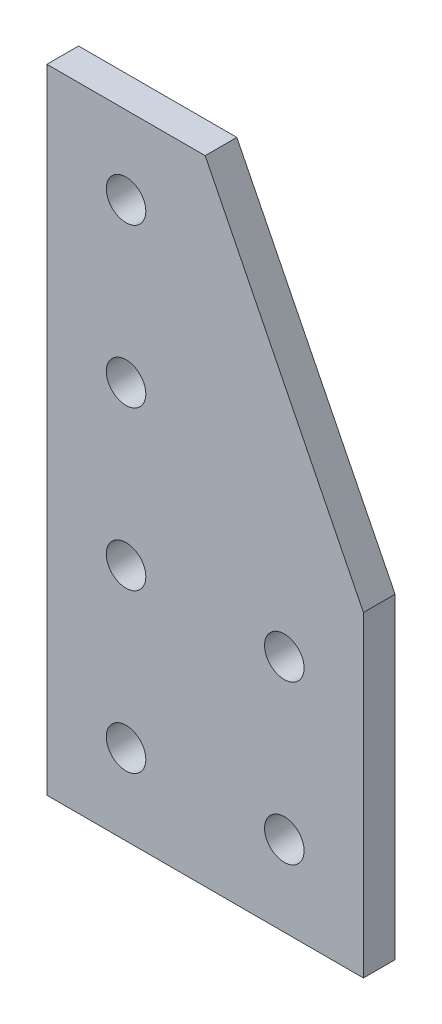
ISO-10303-21;
HEADER;
FILE_DESCRIPTION(('STEP AP214'),'2;1');
FILE_NAME('part.step','',(''),(''),'','','');
FILE_SCHEMA(('AUTOMOTIVE_DESIGN { 1 0 10303 214 1 1 1 1 }'));
ENDSEC;
DATA;
#1=APPLICATION_CONTEXT('core data for automotive mechanical design processes');
#2=APPLICATION_PROTOCOL_DEFINITION('international standard','automotive_design',2000,#1);
#3=PRODUCT_CONTEXT('',#1,'mechanical');
#4=PRODUCT('Part','Part','',(#3));
#5=PRODUCT_RELATED_PRODUCT_CATEGORY('part','',(#4));
#6=PRODUCT_DEFINITION_FORMATION('','',#4);
#7=PRODUCT_DEFINITION_CONTEXT('part definition',#1,'design');
#8=PRODUCT_DEFINITION('design','',#6,#7);
#9=PRODUCT_DEFINITION_SHAPE('','',#8);
#10=(LENGTH_UNIT() NAMED_UNIT(*) SI_UNIT(.MILLI.,.METRE.));
#11=(NAMED_UNIT(*) PLANE_ANGLE_UNIT() SI_UNIT($,.RADIAN.));
#12=(NAMED_UNIT(*) SI_UNIT($,.STERADIAN.) SOLID_ANGLE_UNIT());
#13=UNCERTAINTY_MEASURE_WITH_UNIT(LENGTH_MEASURE(1.E-05),#10,'distance_accuracy_value','');
#14=(GEOMETRIC_REPRESENTATION_CONTEXT(3) GLOBAL_UNCERTAINTY_ASSIGNED_CONTEXT((#13)) GLOBAL_UNIT_ASSIGNED_CONTEXT((#10,
#11,#12)) REPRESENTATION_CONTEXT('',''));
#15=CARTESIAN_POINT('',(0.,0.,0.));
#16=DIRECTION('',(0.,0.,1.));
#17=DIRECTION('',(1.,0.,0.));
#18=AXIS2_PLACEMENT_3D('',#15,#16,#17);
#19=CARTESIAN_POINT('',(0.,-40.,4.));
#20=DIRECTION('',(0.,-1.,0.));
#21=DIRECTION('',(0.,0.,-1.));
#22=AXIS2_PLACEMENT_3D('',#19,#20,#21);
#23=PLANE('',#22);
#24=DIRECTION('',(-1.,0.,0.));
#25=VECTOR('',#24,1.);
#26=CARTESIAN_POINT('',(0.,-40.,0.));
#27=LINE('',#26,#25);
#28=CARTESIAN_POINT('',(40.,-40.,0.));
#29=VERTEX_POINT('',#28);
#30=CARTESIAN_POINT('',(0.,-40.,0.));
#31=VERTEX_POINT('',#30);
#32=EDGE_CURVE('E150',#29,#31,#27,.T.);
#33=ORIENTED_EDGE('',*,*,#32,.F.);
#34=DIRECTION('',(0.,0.,-1.));
#35=VECTOR('',#34,1.);
#36=CARTESIAN_POINT('',(40.,-40.,4.));
#37=LINE('',#36,#35);
#38=CARTESIAN_POINT('',(40.,-40.,4.));
#39=VERTEX_POINT('',#38);
#40=EDGE_CURVE('E11',#39,#29,#37,.T.);
#41=ORIENTED_EDGE('',*,*,#40,.F.);
#42=DIRECTION('',(-1.,0.,0.));
#43=VECTOR('',#42,1.);
#44=CARTESIAN_POINT('',(0.,-40.,4.));
#45=LINE('',#44,#43);
#46=CARTESIAN_POINT('',(0.,-40.,4.));
#47=VERTEX_POINT('',#46);
#48=EDGE_CURVE('E190',#39,#47,#45,.T.);
#49=ORIENTED_EDGE('',*,*,#48,.T.);
#50=DIRECTION('',(0.,0.,-1.));
#51=VECTOR('',#50,1.);
#52=CARTESIAN_POINT('',(0.,-40.,4.));
#53=LINE('',#52,#51);
#54=EDGE_CURVE('E64',#47,#31,#53,.T.);
#55=ORIENTED_EDGE('',*,*,#54,.T.);
#56=EDGE_LOOP('',(#33,#41,#49,#55));
#57=FACE_BOUND('',#56,.T.);
#58=ADVANCED_FACE('F47',(#57),#23,.T.);
#59=CARTESIAN_POINT('',(40.,0.,4.));
#60=DIRECTION('',(1.,0.,0.));
#61=DIRECTION('',(0.,1.,0.));
#62=AXIS2_PLACEMENT_3D('',#59,#60,#61);
#63=PLANE('',#62);
#64=DIRECTION('',(0.,-1.,0.));
#65=VECTOR('',#64,1.);
#66=CARTESIAN_POINT('',(40.,0.,0.));
#67=LINE('',#66,#65);
#68=CARTESIAN_POINT('',(40.,0.,0.));
#69=VERTEX_POINT('',#68);
#70=EDGE_CURVE('E153',#69,#29,#67,.T.);
#71=ORIENTED_EDGE('',*,*,#70,.F.);
#72=DIRECTION('',(0.,0.,-1.));
#73=VECTOR('',#72,1.);
#74=CARTESIAN_POINT('',(40.,0.,4.));
#75=LINE('',#74,#73);
#76=CARTESIAN_POINT('',(40.,0.,4.));
#77=VERTEX_POINT('',#76);
#78=EDGE_CURVE('E56',#77,#69,#75,.T.);
#79=ORIENTED_EDGE('',*,*,#78,.F.);
#80=DIRECTION('',(0.,-1.,0.));
#81=VECTOR('',#80,1.);
#82=CARTESIAN_POINT('',(40.,0.,4.));
#83=LINE('',#82,#81);
#84=EDGE_CURVE('E115',#77,#39,#83,.T.);
#85=ORIENTED_EDGE('',*,*,#84,.T.);
#86=ORIENTED_EDGE('',*,*,#40,.T.);
#87=EDGE_LOOP('',(#71,#79,#85,#86));
#88=FACE_BOUND('',#87,.T.);
#89=ADVANCED_FACE('F197',(#88),#63,.T.);
#90=CARTESIAN_POINT('',(32.,16.,4.));
#91=DIRECTION('',(0.894427190999916,0.447213595499958,0.));
#92=DIRECTION('',(-0.447213595499958,0.894427190999916,0.));
#93=AXIS2_PLACEMENT_3D('',#90,#91,#92);
#94=PLANE('',#93);
#95=DIRECTION('',(0.447213595499958,-0.894427190999916,0.));
#96=VECTOR('',#95,1.);
#97=CARTESIAN_POINT('',(32.,16.,0.));
#98=LINE('',#97,#96);
#99=CARTESIAN_POINT('',(20.,40.,0.));
#100=VERTEX_POINT('',#99);
#101=EDGE_CURVE('E101',#100,#69,#98,.T.);
#102=ORIENTED_EDGE('',*,*,#101,.F.);
#103=DIRECTION('',(0.,0.,-1.));
#104=VECTOR('',#103,1.);
#105=CARTESIAN_POINT('',(20.,40.,4.));
#106=LINE('',#105,#104);
#107=CARTESIAN_POINT('',(20.,40.,4.));
#108=VERTEX_POINT('',#107);
#109=EDGE_CURVE('E96',#108,#100,#106,.T.);
#110=ORIENTED_EDGE('',*,*,#109,.F.);
#111=DIRECTION('',(0.447213595499958,-0.894427190999916,0.));
#112=VECTOR('',#111,1.);
#113=CARTESIAN_POINT('',(32.,16.,4.));
#114=LINE('',#113,#112);
#115=EDGE_CURVE('E99',#108,#77,#114,.T.);
#116=ORIENTED_EDGE('',*,*,#115,.T.);
#117=ORIENTED_EDGE('',*,*,#78,.T.);
#118=EDGE_LOOP('',(#102,#110,#116,#117));
#119=FACE_BOUND('',#118,.T.);
#120=ADVANCED_FACE('F98',(#119),#94,.T.);
#121=CARTESIAN_POINT('',(0.,40.,4.));
#122=DIRECTION('',(0.,1.,0.));
#123=DIRECTION('',(0.,0.,1.));
#124=AXIS2_PLACEMENT_3D('',#121,#122,#123);
#125=PLANE('',#124);
#126=DIRECTION('',(1.,0.,0.));
#127=VECTOR('',#126,1.);
#128=CARTESIAN_POINT('',(0.,40.,0.));
#129=LINE('',#128,#127);
#130=CARTESIAN_POINT('',(0.,40.,0.));
#131=VERTEX_POINT('',#130);
#132=EDGE_CURVE('E159',#131,#100,#129,.T.);
#133=ORIENTED_EDGE('',*,*,#132,.F.);
#134=DIRECTION('',(0.,0.,-1.));
#135=VECTOR('',#134,1.);
#136=CARTESIAN_POINT('',(0.,40.,4.));
#137=LINE('',#136,#135);
#138=CARTESIAN_POINT('',(0.,40.,4.));
#139=VERTEX_POINT('',#138);
#140=EDGE_CURVE('E80',#139,#131,#137,.T.);
#141=ORIENTED_EDGE('',*,*,#140,.F.);
#142=DIRECTION('',(1.,0.,0.));
#143=VECTOR('',#142,1.);
#144=CARTESIAN_POINT('',(0.,40.,4.));
#145=LINE('',#144,#143);
#146=EDGE_CURVE('E113',#139,#108,#145,.T.);
#147=ORIENTED_EDGE('',*,*,#146,.T.);
#148=ORIENTED_EDGE('',*,*,#109,.T.);
#149=EDGE_LOOP('',(#133,#141,#147,#148));
#150=FACE_BOUND('',#149,.T.);
#151=ADVANCED_FACE('F118',(#150),#125,.T.);
#152=CARTESIAN_POINT('',(30.,-29.84,4.));
#153=DIRECTION('',(0.,0.,-1.));
#154=DIRECTION('',(-1.,0.,0.));
#155=AXIS2_PLACEMENT_3D('',#152,#153,#154);
#156=CYLINDRICAL_SURFACE('',#155,2.5);
#157=CARTESIAN_POINT('',(30.,-29.84,4.));
#158=DIRECTION('',(0.,0.,1.));
#159=DIRECTION('',(1.,0.,0.));
#160=AXIS2_PLACEMENT_3D('',#157,#158,#159);
#161=CIRCLE('',#160,2.5);
#162=CARTESIAN_POINT('',(32.5,-29.84,4.));
#163=VERTEX_POINT('',#162);
#164=EDGE_CURVE('E142',#163,#163,#161,.T.);
#165=ORIENTED_EDGE('',*,*,#164,.T.);
#166=EDGE_LOOP('',(#165));
#167=FACE_BOUND('',#166,.T.);
#168=CARTESIAN_POINT('',(30.,-29.84,0.));
#169=DIRECTION('',(0.,0.,1.));
#170=DIRECTION('',(1.,0.,0.));
#171=AXIS2_PLACEMENT_3D('',#168,#169,#170);
#172=CIRCLE('',#171,2.5);
#173=CARTESIAN_POINT('',(32.5,-29.84,0.));
#174=VERTEX_POINT('',#173);
#175=EDGE_CURVE('E182',#174,#174,#172,.T.);
#176=ORIENTED_EDGE('',*,*,#175,.F.);
#177=EDGE_LOOP('',(#176));
#178=FACE_BOUND('',#177,.T.);
#179=ADVANCED_FACE('F225',(#167,#178),#156,.F.);
#180=CARTESIAN_POINT('',(10.,-29.84,4.));
#181=DIRECTION('',(0.,0.,-1.));
#182=DIRECTION('',(-1.,0.,0.));
#183=AXIS2_PLACEMENT_3D('',#180,#181,#182);
#184=CYLINDRICAL_SURFACE('',#183,2.5);
#185=CARTESIAN_POINT('',(10.,-29.84,4.));
#186=DIRECTION('',(0.,0.,1.));
#187=DIRECTION('',(1.,0.,0.));
#188=AXIS2_PLACEMENT_3D('',#185,#186,#187);
#189=CIRCLE('',#188,2.5);
#190=CARTESIAN_POINT('',(12.5,-29.84,4.));
#191=VERTEX_POINT('',#190);
#192=EDGE_CURVE('E138',#191,#191,#189,.T.);
#193=ORIENTED_EDGE('',*,*,#192,.T.);
#194=EDGE_LOOP('',(#193));
#195=FACE_BOUND('',#194,.T.);
#196=CARTESIAN_POINT('',(10.,-29.84,0.));
#197=DIRECTION('',(0.,0.,1.));
#198=DIRECTION('',(1.,0.,0.));
#199=AXIS2_PLACEMENT_3D('',#196,#197,#198);
#200=CIRCLE('',#199,2.5);
#201=CARTESIAN_POINT('',(12.5,-29.84,0.));
#202=VERTEX_POINT('',#201);
#203=EDGE_CURVE('E178',#202,#202,#200,.T.);
#204=ORIENTED_EDGE('',*,*,#203,.F.);
#205=EDGE_LOOP('',(#204));
#206=FACE_BOUND('',#205,.T.);
#207=ADVANCED_FACE('F229',(#195,#206),#184,.F.);
#208=CARTESIAN_POINT('',(10.,-9.83999999999999,4.));
#209=DIRECTION('',(0.,0.,-1.));
#210=DIRECTION('',(-1.,0.,0.));
#211=AXIS2_PLACEMENT_3D('',#208,#209,#210);
#212=CYLINDRICAL_SURFACE('',#211,2.5);
#213=CARTESIAN_POINT('',(10.,-9.83999999999999,4.));
#214=DIRECTION('',(0.,0.,1.));
#215=DIRECTION('',(1.,0.,0.));
#216=AXIS2_PLACEMENT_3D('',#213,#214,#215);
#217=CIRCLE('',#216,2.5);
#218=CARTESIAN_POINT('',(12.5,-9.83999999999999,4.));
#219=VERTEX_POINT('',#218);
#220=EDGE_CURVE('E134',#219,#219,#217,.T.);
#221=ORIENTED_EDGE('',*,*,#220,.T.);
#222=EDGE_LOOP('',(#221));
#223=FACE_BOUND('',#222,.T.);
#224=CARTESIAN_POINT('',(10.,-9.83999999999999,0.));
#225=DIRECTION('',(0.,0.,1.));
#226=DIRECTION('',(1.,0.,0.));
#227=AXIS2_PLACEMENT_3D('',#224,#225,#226);
#228=CIRCLE('',#227,2.5);
#229=CARTESIAN_POINT('',(12.5,-9.83999999999999,0.));
#230=VERTEX_POINT('',#229);
#231=EDGE_CURVE('E174',#230,#230,#228,.T.);
#232=ORIENTED_EDGE('',*,*,#231,.F.);
#233=EDGE_LOOP('',(#232));
#234=FACE_BOUND('',#233,.T.);
#235=ADVANCED_FACE('F235',(#223,#234),#212,.F.);
#236=CARTESIAN_POINT('',(10.,10.16,4.));
#237=DIRECTION('',(0.,0.,-1.));
#238=DIRECTION('',(-1.,0.,0.));
#239=AXIS2_PLACEMENT_3D('',#236,#237,#238);
#240=CYLINDRICAL_SURFACE('',#239,2.5);
#241=CARTESIAN_POINT('',(10.,10.16,4.));
#242=DIRECTION('',(0.,0.,1.));
#243=DIRECTION('',(1.,0.,0.));
#244=AXIS2_PLACEMENT_3D('',#241,#242,#243);
#245=CIRCLE('',#244,2.5);
#246=CARTESIAN_POINT('',(12.5,10.16,4.));
#247=VERTEX_POINT('',#246);
#248=EDGE_CURVE('E130',#247,#247,#245,.T.);
#249=ORIENTED_EDGE('',*,*,#248,.T.);
#250=EDGE_LOOP('',(#249));
#251=FACE_BOUND('',#250,.T.);
#252=CARTESIAN_POINT('',(10.,10.16,0.));
#253=DIRECTION('',(0.,0.,1.));
#254=DIRECTION('',(1.,0.,0.));
#255=AXIS2_PLACEMENT_3D('',#252,#253,#254);
#256=CIRCLE('',#255,2.5);
#257=CARTESIAN_POINT('',(12.5,10.16,0.));
#258=VERTEX_POINT('',#257);
#259=EDGE_CURVE('E170',#258,#258,#256,.T.);
#260=ORIENTED_EDGE('',*,*,#259,.F.);
#261=EDGE_LOOP('',(#260));
#262=FACE_BOUND('',#261,.T.);
#263=ADVANCED_FACE('F212',(#251,#262),#240,.F.);
#264=CARTESIAN_POINT('',(10.,30.16,4.));
#265=DIRECTION('',(0.,0.,-1.));
#266=DIRECTION('',(-1.,0.,0.));
#267=AXIS2_PLACEMENT_3D('',#264,#265,#266);
#268=CYLINDRICAL_SURFACE('',#267,2.5);
#269=CARTESIAN_POINT('',(10.,30.16,4.));
#270=DIRECTION('',(0.,0.,1.));
#271=DIRECTION('',(1.,0.,0.));
#272=AXIS2_PLACEMENT_3D('',#269,#270,#271);
#273=CIRCLE('',#272,2.5);
#274=CARTESIAN_POINT('',(12.5,30.16,4.));
#275=VERTEX_POINT('',#274);
#276=EDGE_CURVE('E123',#275,#275,#273,.T.);
#277=ORIENTED_EDGE('',*,*,#276,.T.);
#278=EDGE_LOOP('',(#277));
#279=FACE_BOUND('',#278,.T.);
#280=CARTESIAN_POINT('',(10.,30.16,0.));
#281=DIRECTION('',(0.,0.,1.));
#282=DIRECTION('',(1.,0.,0.));
#283=AXIS2_PLACEMENT_3D('',#280,#281,#282);
#284=CIRCLE('',#283,2.5);
#285=CARTESIAN_POINT('',(12.5,30.16,0.));
#286=VERTEX_POINT('',#285);
#287=EDGE_CURVE('E166',#286,#286,#284,.T.);
#288=ORIENTED_EDGE('',*,*,#287,.F.);
#289=EDGE_LOOP('',(#288));
#290=FACE_BOUND('',#289,.T.);
#291=ADVANCED_FACE('F204',(#279,#290),#268,.F.);
#292=CARTESIAN_POINT('',(0.,0.,4.));
#293=DIRECTION('',(-1.,0.,0.));
#294=DIRECTION('',(0.,0.,1.));
#295=AXIS2_PLACEMENT_3D('',#292,#293,#294);
#296=PLANE('',#295);
#297=DIRECTION('',(0.,1.,0.));
#298=VECTOR('',#297,1.);
#299=CARTESIAN_POINT('',(0.,0.,0.));
#300=LINE('',#299,#298);
#301=EDGE_CURVE('E162',#31,#131,#300,.T.);
#302=ORIENTED_EDGE('',*,*,#301,.F.);
#303=ORIENTED_EDGE('',*,*,#54,.F.);
#304=DIRECTION('',(0.,1.,0.));
#305=VECTOR('',#304,1.);
#306=CARTESIAN_POINT('',(0.,0.,4.));
#307=LINE('',#306,#305);
#308=EDGE_CURVE('E120',#47,#139,#307,.T.);
#309=ORIENTED_EDGE('',*,*,#308,.T.);
#310=ORIENTED_EDGE('',*,*,#140,.T.);
#311=EDGE_LOOP('',(#302,#303,#309,#310));
#312=FACE_BOUND('',#311,.T.);
#313=ADVANCED_FACE('F201',(#312),#296,.T.);
#314=CARTESIAN_POINT('',(30.,-9.83999999999999,4.));
#315=DIRECTION('',(0.,0.,-1.));
#316=DIRECTION('',(-1.,0.,0.));
#317=AXIS2_PLACEMENT_3D('',#314,#315,#316);
#318=CYLINDRICAL_SURFACE('',#317,2.5);
#319=CARTESIAN_POINT('',(30.,-9.83999999999999,4.));
#320=DIRECTION('',(0.,0.,1.));
#321=DIRECTION('',(1.,0.,0.));
#322=AXIS2_PLACEMENT_3D('',#319,#320,#321);
#323=CIRCLE('',#322,2.5);
#324=CARTESIAN_POINT('',(32.5,-9.83999999999999,4.));
#325=VERTEX_POINT('',#324);
#326=EDGE_CURVE('E146',#325,#325,#323,.F.);
#327=ORIENTED_EDGE('',*,*,#326,.F.);
#328=EDGE_LOOP('',(#327));
#329=FACE_BOUND('',#328,.T.);
#330=CARTESIAN_POINT('',(30.,-9.83999999999999,0.));
#331=DIRECTION('',(0.,0.,1.));
#332=DIRECTION('',(1.,0.,0.));
#333=AXIS2_PLACEMENT_3D('',#330,#331,#332);
#334=CIRCLE('',#333,2.5);
#335=CARTESIAN_POINT('',(32.5,-9.83999999999999,0.));
#336=VERTEX_POINT('',#335);
#337=EDGE_CURVE('E186',#336,#336,#334,.F.);
#338=ORIENTED_EDGE('',*,*,#337,.T.);
#339=EDGE_LOOP('',(#338));
#340=FACE_BOUND('',#339,.T.);
#341=ADVANCED_FACE('F203',(#329,#340),#318,.F.);
#342=CARTESIAN_POINT('',(0.,0.,4.));
#343=DIRECTION('',(0.,0.,1.));
#344=DIRECTION('',(1.,0.,0.));
#345=AXIS2_PLACEMENT_3D('',#342,#343,#344);
#346=PLANE('',#345);
#347=ORIENTED_EDGE('',*,*,#48,.F.);
#348=ORIENTED_EDGE('',*,*,#84,.F.);
#349=ORIENTED_EDGE('',*,*,#115,.F.);
#350=ORIENTED_EDGE('',*,*,#146,.F.);
#351=ORIENTED_EDGE('',*,*,#308,.F.);
#352=EDGE_LOOP('',(#347,#348,#349,#350,#351));
#353=FACE_BOUND('',#352,.T.);
#354=ORIENTED_EDGE('',*,*,#276,.F.);
#355=EDGE_LOOP('',(#354));
#356=FACE_BOUND('',#355,.T.);
#357=ORIENTED_EDGE('',*,*,#248,.F.);
#358=EDGE_LOOP('',(#357));
#359=FACE_BOUND('',#358,.T.);
#360=ORIENTED_EDGE('',*,*,#220,.F.);
#361=EDGE_LOOP('',(#360));
#362=FACE_BOUND('',#361,.T.);
#363=ORIENTED_EDGE('',*,*,#192,.F.);
#364=EDGE_LOOP('',(#363));
#365=FACE_BOUND('',#364,.T.);
#366=ORIENTED_EDGE('',*,*,#164,.F.);
#367=EDGE_LOOP('',(#366));
#368=FACE_BOUND('',#367,.T.);
#369=ORIENTED_EDGE('',*,*,#326,.T.);
#370=EDGE_LOOP('',(#369));
#371=FACE_BOUND('',#370,.T.);
#372=ADVANCED_FACE('F110',(#353,#356,#359,#362,#365,#368,#371),#346,.T.);
#373=CARTESIAN_POINT('',(0.,0.,0.));
#374=DIRECTION('',(0.,0.,1.));
#375=DIRECTION('',(1.,0.,0.));
#376=AXIS2_PLACEMENT_3D('',#373,#374,#375);
#377=PLANE('',#376);
#378=ORIENTED_EDGE('',*,*,#32,.T.);
#379=ORIENTED_EDGE('',*,*,#301,.T.);
#380=ORIENTED_EDGE('',*,*,#132,.T.);
#381=ORIENTED_EDGE('',*,*,#101,.T.);
#382=ORIENTED_EDGE('',*,*,#70,.T.);
#383=EDGE_LOOP('',(#378,#379,#380,#381,#382));
#384=FACE_BOUND('',#383,.T.);
#385=ORIENTED_EDGE('',*,*,#287,.T.);
#386=EDGE_LOOP('',(#385));
#387=FACE_BOUND('',#386,.T.);
#388=ORIENTED_EDGE('',*,*,#259,.T.);
#389=EDGE_LOOP('',(#388));
#390=FACE_BOUND('',#389,.T.);
#391=ORIENTED_EDGE('',*,*,#231,.T.);
#392=EDGE_LOOP('',(#391));
#393=FACE_BOUND('',#392,.T.);
#394=ORIENTED_EDGE('',*,*,#203,.T.);
#395=EDGE_LOOP('',(#394));
#396=FACE_BOUND('',#395,.T.);
#397=ORIENTED_EDGE('',*,*,#175,.T.);
#398=EDGE_LOOP('',(#397));
#399=FACE_BOUND('',#398,.T.);
#400=ORIENTED_EDGE('',*,*,#337,.F.);
#401=EDGE_LOOP('',(#400));
#402=FACE_BOUND('',#401,.T.);
#403=ADVANCED_FACE('F199',(#384,#387,#390,#393,#396,#399,#402),#377,.F.);
#404=CLOSED_SHELL('',(#58,#89,#120,#151,#179,#207,#235,#263,#291,#313,#341,#372,#403));
#405=MANIFOLD_SOLID_BREP('B2',#404);
#406=ADVANCED_BREP_SHAPE_REPRESENTATION('',(#18,#405),#14);
#407=SHAPE_DEFINITION_REPRESENTATION(#9,#406);
ENDSEC;
END-ISO-10303-21;
